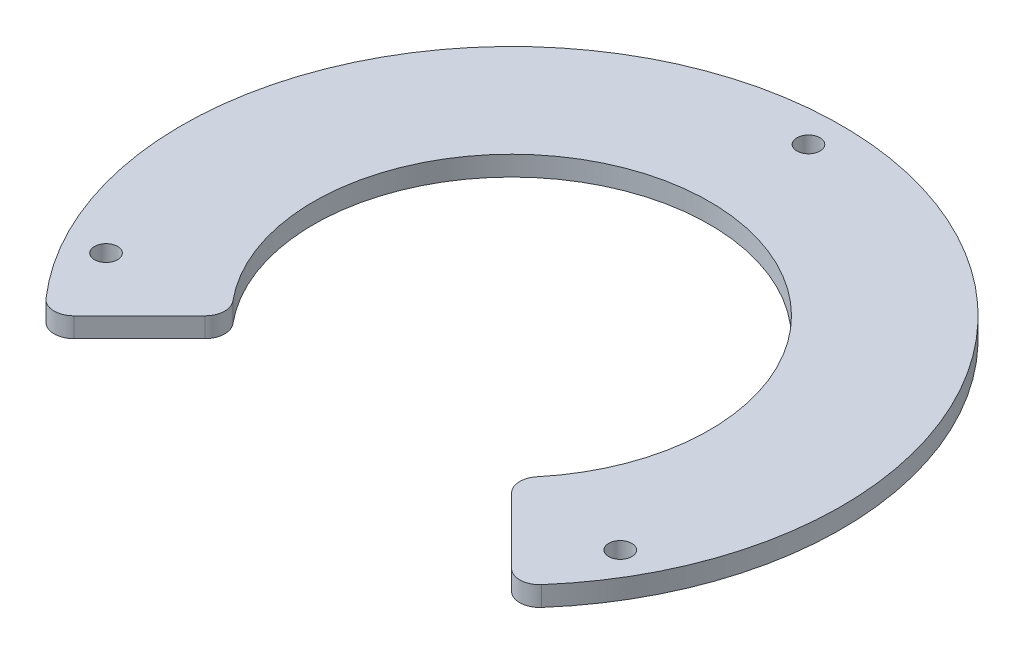
ISO-10303-21;
HEADER;
FILE_DESCRIPTION(('STEP AP214'),'2;1');
FILE_NAME('part.step','',(''),(''),'','','');
FILE_SCHEMA(('AUTOMOTIVE_DESIGN { 1 0 10303 214 1 1 1 1 }'));
ENDSEC;
DATA;
#1=APPLICATION_CONTEXT('core data for automotive mechanical design processes');
#2=APPLICATION_PROTOCOL_DEFINITION('international standard','automotive_design',2000,#1);
#3=PRODUCT_CONTEXT('',#1,'mechanical');
#4=PRODUCT('Part','Part','',(#3));
#5=PRODUCT_RELATED_PRODUCT_CATEGORY('part','',(#4));
#6=PRODUCT_DEFINITION_FORMATION('','',#4);
#7=PRODUCT_DEFINITION_CONTEXT('part definition',#1,'design');
#8=PRODUCT_DEFINITION('design','',#6,#7);
#9=PRODUCT_DEFINITION_SHAPE('','',#8);
#10=(LENGTH_UNIT() NAMED_UNIT(*) SI_UNIT(.MILLI.,.METRE.));
#11=(NAMED_UNIT(*) PLANE_ANGLE_UNIT() SI_UNIT($,.RADIAN.));
#12=(NAMED_UNIT(*) SI_UNIT($,.STERADIAN.) SOLID_ANGLE_UNIT());
#13=UNCERTAINTY_MEASURE_WITH_UNIT(LENGTH_MEASURE(1.E-05),#10,'distance_accuracy_value','');
#14=(GEOMETRIC_REPRESENTATION_CONTEXT(3) GLOBAL_UNCERTAINTY_ASSIGNED_CONTEXT((#13)) GLOBAL_UNIT_ASSIGNED_CONTEXT((#10,
#11,#12)) REPRESENTATION_CONTEXT('',''));
#15=CARTESIAN_POINT('',(0.,0.,0.));
#16=DIRECTION('',(0.,0.,1.));
#17=DIRECTION('',(1.,0.,0.));
#18=AXIS2_PLACEMENT_3D('',#15,#16,#17);
#19=CARTESIAN_POINT('',(0.,3.,0.));
#20=DIRECTION('',(0.,1.,0.));
#21=DIRECTION('',(0.,0.,1.));
#22=AXIS2_PLACEMENT_3D('',#19,#20,#21);
#23=PLANE('',#22);
#24=DIRECTION('',(-0.707106781186546,0.,0.707106781186549));
#25=VECTOR('',#24,1.);
#26=CARTESIAN_POINT('',(0.,3.,0.));
#27=LINE('',#26,#25);
#28=CARTESIAN_POINT('',(-23.2379000772445,3.,23.2379000772445));
#29=VERTEX_POINT('',#28);
#30=CARTESIAN_POINT('',(-33.166247903554,3.,33.1662479035541));
#31=VERTEX_POINT('',#30);
#32=EDGE_CURVE('E122',#29,#31,#27,.T.);
#33=ORIENTED_EDGE('',*,*,#32,.F.);
#34=CARTESIAN_POINT('',(-25.3592204208041,3.,21.1165797336849));
#35=DIRECTION('',(0.,1.,0.));
#36=DIRECTION('',(0.,0.,1.));
#37=AXIS2_PLACEMENT_3D('',#34,#35,#36);
#38=CIRCLE('',#37,3.);
#39=CARTESIAN_POINT('',(-23.0538367461855,3.,19.1968906669863));
#40=VERTEX_POINT('',#39);
#41=EDGE_CURVE('E125',#29,#40,#38,.T.);
#42=ORIENTED_EDGE('',*,*,#41,.T.);
#43=CARTESIAN_POINT('',(0.,3.,0.));
#44=DIRECTION('',(0.,1.,0.));
#45=DIRECTION('',(0.,0.,1.));
#46=AXIS2_PLACEMENT_3D('',#43,#44,#45);
#47=CIRCLE('',#46,30.);
#48=CARTESIAN_POINT('',(23.0538367461856,3.,19.1968906669863));
#49=VERTEX_POINT('',#48);
#50=EDGE_CURVE('E177',#49,#40,#47,.T.);
#51=ORIENTED_EDGE('',*,*,#50,.F.);
#52=CARTESIAN_POINT('',(25.3592204208041,3.,21.1165797336849));
#53=DIRECTION('',(0.,1.,0.));
#54=DIRECTION('',(0.,0.,1.));
#55=AXIS2_PLACEMENT_3D('',#52,#53,#54);
#56=CIRCLE('',#55,3.);
#57=CARTESIAN_POINT('',(23.2379000772445,3.,23.2379000772445));
#58=VERTEX_POINT('',#57);
#59=EDGE_CURVE('E126',#49,#58,#56,.T.);
#60=ORIENTED_EDGE('',*,*,#59,.T.);
#61=DIRECTION('',(-0.707106781186546,0.,-0.707106781186549));
#62=VECTOR('',#61,1.);
#63=CARTESIAN_POINT('',(49.9999999999998,3.,50.));
#64=LINE('',#63,#62);
#65=CARTESIAN_POINT('',(33.1662479035539,3.,33.1662479035541));
#66=VERTEX_POINT('',#65);
#67=EDGE_CURVE('E154',#66,#58,#64,.T.);
#68=ORIENTED_EDGE('',*,*,#67,.F.);
#69=CARTESIAN_POINT('',(35.2875682471136,3.,31.0449275599944));
#70=DIRECTION('',(0.,1.,0.));
#71=DIRECTION('',(0.,0.,1.));
#72=AXIS2_PLACEMENT_3D('',#69,#70,#71);
#73=CIRCLE('',#72,3.);
#74=CARTESIAN_POINT('',(37.5399662203336,3.,33.0265186808451));
#75=VERTEX_POINT('',#74);
#76=EDGE_CURVE('E128',#66,#75,#73,.T.);
#77=ORIENTED_EDGE('',*,*,#76,.T.);
#78=CARTESIAN_POINT('',(0.,3.,0.));
#79=DIRECTION('',(0.,1.,0.));
#80=DIRECTION('',(0.,0.,1.));
#81=AXIS2_PLACEMENT_3D('',#78,#79,#80);
#82=CIRCLE('',#81,50.);
#83=CARTESIAN_POINT('',(-37.5399662203336,3.,33.0265186808451));
#84=VERTEX_POINT('',#83);
#85=EDGE_CURVE('E130',#75,#84,#82,.T.);
#86=ORIENTED_EDGE('',*,*,#85,.T.);
#87=CARTESIAN_POINT('',(-35.2875682471136,3.,31.0449275599944));
#88=DIRECTION('',(0.,1.,0.));
#89=DIRECTION('',(0.,0.,1.));
#90=AXIS2_PLACEMENT_3D('',#87,#88,#89);
#91=CIRCLE('',#90,3.);
#92=EDGE_CURVE('E135',#84,#31,#91,.T.);
#93=ORIENTED_EDGE('',*,*,#92,.T.);
#94=EDGE_LOOP('',(#33,#42,#51,#60,#68,#77,#86,#93));
#95=FACE_BOUND('',#94,.T.);
#96=CARTESIAN_POINT('',(38.9711431703026,3.,22.4999999999983));
#97=DIRECTION('',(0.,1.,0.));
#98=DIRECTION('',(0.,0.,1.));
#99=AXIS2_PLACEMENT_3D('',#96,#97,#98);
#100=CIRCLE('',#99,1.75000000000246);
#101=CARTESIAN_POINT('',(38.9711431703026,3.,24.2500000000008));
#102=VERTEX_POINT('',#101);
#103=EDGE_CURVE('E166',#102,#102,#100,.T.);
#104=ORIENTED_EDGE('',*,*,#103,.F.);
#105=EDGE_LOOP('',(#104));
#106=FACE_BOUND('',#105,.T.);
#107=CARTESIAN_POINT('',(0.,3.,-45.));
#108=DIRECTION('',(0.,1.,0.));
#109=DIRECTION('',(0.,0.,1.));
#110=AXIS2_PLACEMENT_3D('',#107,#108,#109);
#111=CIRCLE('',#110,1.75);
#112=CARTESIAN_POINT('',(0.,3.,-43.25));
#113=VERTEX_POINT('',#112);
#114=EDGE_CURVE('E172',#113,#113,#111,.T.);
#115=ORIENTED_EDGE('',*,*,#114,.F.);
#116=EDGE_LOOP('',(#115));
#117=FACE_BOUND('',#116,.T.);
#118=CARTESIAN_POINT('',(-38.9711431702969,3.,22.5000000000017));
#119=DIRECTION('',(0.,1.,0.));
#120=DIRECTION('',(0.,0.,1.));
#121=AXIS2_PLACEMENT_3D('',#118,#119,#120);
#122=CIRCLE('',#121,1.75000000000364);
#123=CARTESIAN_POINT('',(-38.9711431702969,3.,24.2500000000053));
#124=VERTEX_POINT('',#123);
#125=EDGE_CURVE('E159',#124,#124,#122,.T.);
#126=ORIENTED_EDGE('',*,*,#125,.F.);
#127=EDGE_LOOP('',(#126));
#128=FACE_BOUND('',#127,.T.);
#129=ADVANCED_FACE('F33',(#95,#106,#117,#128),#23,.T.);
#130=CARTESIAN_POINT('',(0.,0.,0.));
#131=DIRECTION('',(0.,1.,0.));
#132=DIRECTION('',(0.,0.,1.));
#133=AXIS2_PLACEMENT_3D('',#130,#131,#132);
#134=PLANE('',#133);
#135=CARTESIAN_POINT('',(0.,0.,0.));
#136=DIRECTION('',(0.,1.,0.));
#137=DIRECTION('',(0.,0.,1.));
#138=AXIS2_PLACEMENT_3D('',#135,#136,#137);
#139=CIRCLE('',#138,30.);
#140=CARTESIAN_POINT('',(23.0538367461856,0.,19.1968906669863));
#141=VERTEX_POINT('',#140);
#142=CARTESIAN_POINT('',(-23.0538367461855,0.,19.1968906669863));
#143=VERTEX_POINT('',#142);
#144=EDGE_CURVE('E106',#141,#143,#139,.T.);
#145=ORIENTED_EDGE('',*,*,#144,.T.);
#146=CARTESIAN_POINT('',(-25.3592204208041,0.,21.1165797336849));
#147=DIRECTION('',(0.,1.,0.));
#148=DIRECTION('',(0.,0.,1.));
#149=AXIS2_PLACEMENT_3D('',#146,#147,#148);
#150=CIRCLE('',#149,3.);
#151=CARTESIAN_POINT('',(-23.2379000772445,0.,23.2379000772445));
#152=VERTEX_POINT('',#151);
#153=EDGE_CURVE('E99',#143,#152,#150,.F.);
#154=ORIENTED_EDGE('',*,*,#153,.T.);
#155=DIRECTION('',(-0.707106781186546,0.,0.707106781186549));
#156=VECTOR('',#155,1.);
#157=CARTESIAN_POINT('',(0.,0.,0.));
#158=LINE('',#157,#156);
#159=CARTESIAN_POINT('',(-33.166247903554,0.,33.1662479035541));
#160=VERTEX_POINT('',#159);
#161=EDGE_CURVE('E103',#152,#160,#158,.T.);
#162=ORIENTED_EDGE('',*,*,#161,.T.);
#163=CARTESIAN_POINT('',(-35.2875682471136,0.,31.0449275599944));
#164=DIRECTION('',(0.,1.,0.));
#165=DIRECTION('',(0.,0.,1.));
#166=AXIS2_PLACEMENT_3D('',#163,#164,#165);
#167=CIRCLE('',#166,3.);
#168=CARTESIAN_POINT('',(-37.5399662203336,0.,33.0265186808451));
#169=VERTEX_POINT('',#168);
#170=EDGE_CURVE('E111',#160,#169,#167,.F.);
#171=ORIENTED_EDGE('',*,*,#170,.T.);
#172=CARTESIAN_POINT('',(0.,0.,0.));
#173=DIRECTION('',(0.,1.,0.));
#174=DIRECTION('',(0.,0.,1.));
#175=AXIS2_PLACEMENT_3D('',#172,#173,#174);
#176=CIRCLE('',#175,50.);
#177=CARTESIAN_POINT('',(37.5399662203336,0.,33.0265186808451));
#178=VERTEX_POINT('',#177);
#179=EDGE_CURVE('E180',#178,#169,#176,.T.);
#180=ORIENTED_EDGE('',*,*,#179,.F.);
#181=CARTESIAN_POINT('',(35.2875682471136,0.,31.0449275599944));
#182=DIRECTION('',(0.,1.,0.));
#183=DIRECTION('',(0.,0.,1.));
#184=AXIS2_PLACEMENT_3D('',#181,#182,#183);
#185=CIRCLE('',#184,3.);
#186=CARTESIAN_POINT('',(33.166247903554,0.,33.1662479035541));
#187=VERTEX_POINT('',#186);
#188=EDGE_CURVE('E56',#178,#187,#185,.F.);
#189=ORIENTED_EDGE('',*,*,#188,.T.);
#190=DIRECTION('',(-0.707106781186546,0.,-0.707106781186549));
#191=VECTOR('',#190,1.);
#192=CARTESIAN_POINT('',(0.,0.,0.));
#193=LINE('',#192,#191);
#194=CARTESIAN_POINT('',(23.2379000772445,0.,23.2379000772445));
#195=VERTEX_POINT('',#194);
#196=EDGE_CURVE('E121',#187,#195,#193,.T.);
#197=ORIENTED_EDGE('',*,*,#196,.T.);
#198=CARTESIAN_POINT('',(25.3592204208041,0.,21.1165797336849));
#199=DIRECTION('',(0.,1.,0.));
#200=DIRECTION('',(0.,0.,1.));
#201=AXIS2_PLACEMENT_3D('',#198,#199,#200);
#202=CIRCLE('',#201,3.);
#203=EDGE_CURVE('E48',#195,#141,#202,.F.);
#204=ORIENTED_EDGE('',*,*,#203,.T.);
#205=EDGE_LOOP('',(#145,#154,#162,#171,#180,#189,#197,#204));
#206=FACE_BOUND('',#205,.T.);
#207=CARTESIAN_POINT('',(0.,0.,-45.));
#208=DIRECTION('',(0.,1.,0.));
#209=DIRECTION('',(0.,0.,1.));
#210=AXIS2_PLACEMENT_3D('',#207,#208,#209);
#211=CIRCLE('',#210,1.75);
#212=CARTESIAN_POINT('',(0.,0.,-43.25));
#213=VERTEX_POINT('',#212);
#214=EDGE_CURVE('E169',#213,#213,#211,.T.);
#215=ORIENTED_EDGE('',*,*,#214,.T.);
#216=EDGE_LOOP('',(#215));
#217=FACE_BOUND('',#216,.T.);
#218=CARTESIAN_POINT('',(38.9711431703026,0.,22.4999999999983));
#219=DIRECTION('',(0.,1.,0.));
#220=DIRECTION('',(0.,0.,1.));
#221=AXIS2_PLACEMENT_3D('',#218,#219,#220);
#222=CIRCLE('',#221,1.75000000000246);
#223=CARTESIAN_POINT('',(38.9711431703026,0.,24.2500000000008));
#224=VERTEX_POINT('',#223);
#225=EDGE_CURVE('E164',#224,#224,#222,.T.);
#226=ORIENTED_EDGE('',*,*,#225,.T.);
#227=EDGE_LOOP('',(#226));
#228=FACE_BOUND('',#227,.T.);
#229=CARTESIAN_POINT('',(-38.9711431702969,0.,22.5000000000017));
#230=DIRECTION('',(0.,1.,0.));
#231=DIRECTION('',(0.,0.,1.));
#232=AXIS2_PLACEMENT_3D('',#229,#230,#231);
#233=CIRCLE('',#232,1.75000000000364);
#234=CARTESIAN_POINT('',(-38.9711431702969,0.,24.2500000000053));
#235=VERTEX_POINT('',#234);
#236=EDGE_CURVE('E156',#235,#235,#233,.T.);
#237=ORIENTED_EDGE('',*,*,#236,.T.);
#238=EDGE_LOOP('',(#237));
#239=FACE_BOUND('',#238,.T.);
#240=ADVANCED_FACE('F101',(#206,#217,#228,#239),#134,.F.);
#241=CARTESIAN_POINT('',(0.,3.,0.));
#242=DIRECTION('',(0.,-1.,0.));
#243=DIRECTION('',(0.,0.,-1.));
#244=AXIS2_PLACEMENT_3D('',#241,#242,#243);
#245=CYLINDRICAL_SURFACE('',#244,50.);
#246=ORIENTED_EDGE('',*,*,#179,.T.);
#247=DIRECTION('',(0.,-1.,0.));
#248=VECTOR('',#247,1.);
#249=CARTESIAN_POINT('',(-37.5399662203336,3.,33.0265186808451));
#250=LINE('',#249,#248);
#251=EDGE_CURVE('E147',#169,#84,#250,.F.);
#252=ORIENTED_EDGE('',*,*,#251,.T.);
#253=ORIENTED_EDGE('',*,*,#85,.F.);
#254=DIRECTION('',(0.,-1.,0.));
#255=VECTOR('',#254,1.);
#256=CARTESIAN_POINT('',(37.5399662203336,3.,33.0265186808451));
#257=LINE('',#256,#255);
#258=EDGE_CURVE('E110',#75,#178,#257,.T.);
#259=ORIENTED_EDGE('',*,*,#258,.T.);
#260=EDGE_LOOP('',(#246,#252,#253,#259));
#261=FACE_BOUND('',#260,.T.);
#262=ADVANCED_FACE('F186',(#261),#245,.T.);
#263=CARTESIAN_POINT('',(0.,3.,0.));
#264=DIRECTION('',(0.,-1.,0.));
#265=DIRECTION('',(0.,0.,-1.));
#266=AXIS2_PLACEMENT_3D('',#263,#264,#265);
#267=CYLINDRICAL_SURFACE('',#266,30.);
#268=ORIENTED_EDGE('',*,*,#50,.T.);
#269=DIRECTION('',(0.,-1.,0.));
#270=VECTOR('',#269,1.);
#271=CARTESIAN_POINT('',(-23.0538367461856,3.,19.1968906669863));
#272=LINE('',#271,#270);
#273=EDGE_CURVE('E140',#40,#143,#272,.T.);
#274=ORIENTED_EDGE('',*,*,#273,.T.);
#275=ORIENTED_EDGE('',*,*,#144,.F.);
#276=DIRECTION('',(0.,-1.,0.));
#277=VECTOR('',#276,1.);
#278=CARTESIAN_POINT('',(23.0538367461856,3.,19.1968906669863));
#279=LINE('',#278,#277);
#280=EDGE_CURVE('E138',#141,#49,#279,.F.);
#281=ORIENTED_EDGE('',*,*,#280,.T.);
#282=EDGE_LOOP('',(#268,#274,#275,#281));
#283=FACE_BOUND('',#282,.T.);
#284=ADVANCED_FACE('F199',(#283),#267,.F.);
#285=CARTESIAN_POINT('',(0.,3.,-45.));
#286=DIRECTION('',(0.,-1.,0.));
#287=DIRECTION('',(0.,0.,-1.));
#288=AXIS2_PLACEMENT_3D('',#285,#286,#287);
#289=CYLINDRICAL_SURFACE('',#288,1.75);
#290=ORIENTED_EDGE('',*,*,#114,.T.);
#291=EDGE_LOOP('',(#290));
#292=FACE_BOUND('',#291,.T.);
#293=ORIENTED_EDGE('',*,*,#214,.F.);
#294=EDGE_LOOP('',(#293));
#295=FACE_BOUND('',#294,.T.);
#296=ADVANCED_FACE('F201',(#292,#295),#289,.F.);
#297=CARTESIAN_POINT('',(38.9711431703026,3.,22.4999999999983));
#298=DIRECTION('',(0.,-1.,0.));
#299=DIRECTION('',(0.,0.,-1.));
#300=AXIS2_PLACEMENT_3D('',#297,#298,#299);
#301=CYLINDRICAL_SURFACE('',#300,1.75000000000246);
#302=ORIENTED_EDGE('',*,*,#103,.T.);
#303=EDGE_LOOP('',(#302));
#304=FACE_BOUND('',#303,.T.);
#305=ORIENTED_EDGE('',*,*,#225,.F.);
#306=EDGE_LOOP('',(#305));
#307=FACE_BOUND('',#306,.T.);
#308=ADVANCED_FACE('F207',(#304,#307),#301,.F.);
#309=CARTESIAN_POINT('',(-38.9711431702969,3.,22.5000000000017));
#310=DIRECTION('',(0.,-1.,0.));
#311=DIRECTION('',(0.,0.,-1.));
#312=AXIS2_PLACEMENT_3D('',#309,#310,#311);
#313=CYLINDRICAL_SURFACE('',#312,1.75000000000364);
#314=ORIENTED_EDGE('',*,*,#125,.T.);
#315=EDGE_LOOP('',(#314));
#316=FACE_BOUND('',#315,.T.);
#317=ORIENTED_EDGE('',*,*,#236,.F.);
#318=EDGE_LOOP('',(#317));
#319=FACE_BOUND('',#318,.T.);
#320=ADVANCED_FACE('F259',(#316,#319),#313,.F.);
#321=CARTESIAN_POINT('',(0.,-11.,0.));
#322=DIRECTION('',(-0.707106781186549,0.,-0.707106781186546));
#323=DIRECTION('',(-0.707106781186546,0.,0.707106781186549));
#324=AXIS2_PLACEMENT_3D('',#321,#322,#323);
#325=PLANE('',#324);
#326=ORIENTED_EDGE('',*,*,#161,.F.);
#327=DIRECTION('',(0.,1.,0.));
#328=VECTOR('',#327,1.);
#329=CARTESIAN_POINT('',(-23.2379000772445,3.,23.2379000772445));
#330=LINE('',#329,#328);
#331=EDGE_CURVE('E117',#152,#29,#330,.T.);
#332=ORIENTED_EDGE('',*,*,#331,.T.);
#333=ORIENTED_EDGE('',*,*,#32,.T.);
#334=DIRECTION('',(0.,-1.,0.));
#335=VECTOR('',#334,1.);
#336=CARTESIAN_POINT('',(-33.166247903554,-11.,33.1662479035541));
#337=LINE('',#336,#335);
#338=EDGE_CURVE('E120',#31,#160,#337,.T.);
#339=ORIENTED_EDGE('',*,*,#338,.T.);
#340=EDGE_LOOP('',(#326,#332,#333,#339));
#341=FACE_BOUND('',#340,.T.);
#342=ADVANCED_FACE('F115',(#341),#325,.F.);
#343=CARTESIAN_POINT('',(49.9999999999998,-11.,50.));
#344=DIRECTION('',(0.707106781186549,0.,-0.707106781186546));
#345=DIRECTION('',(-0.707106781186546,0.,-0.707106781186549));
#346=AXIS2_PLACEMENT_3D('',#343,#344,#345);
#347=PLANE('',#346);
#348=ORIENTED_EDGE('',*,*,#196,.F.);
#349=DIRECTION('',(0.,-1.,0.));
#350=VECTOR('',#349,1.);
#351=CARTESIAN_POINT('',(33.1662479035539,-11.,33.1662479035541));
#352=LINE('',#351,#350);
#353=EDGE_CURVE('E11',#187,#66,#352,.F.);
#354=ORIENTED_EDGE('',*,*,#353,.T.);
#355=ORIENTED_EDGE('',*,*,#67,.T.);
#356=DIRECTION('',(0.,1.,0.));
#357=VECTOR('',#356,1.);
#358=CARTESIAN_POINT('',(23.2379000772445,0.,23.2379000772445));
#359=LINE('',#358,#357);
#360=EDGE_CURVE('E41',#58,#195,#359,.F.);
#361=ORIENTED_EDGE('',*,*,#360,.T.);
#362=EDGE_LOOP('',(#348,#354,#355,#361));
#363=FACE_BOUND('',#362,.T.);
#364=ADVANCED_FACE('F151',(#363),#347,.F.);
#365=CARTESIAN_POINT('',(-25.3592204208041,3.,21.1165797336849));
#366=DIRECTION('',(0.,-1.,0.));
#367=DIRECTION('',(0.,0.,-1.));
#368=AXIS2_PLACEMENT_3D('',#365,#366,#367);
#369=CYLINDRICAL_SURFACE('',#368,3.);
#370=ORIENTED_EDGE('',*,*,#153,.F.);
#371=ORIENTED_EDGE('',*,*,#273,.F.);
#372=ORIENTED_EDGE('',*,*,#41,.F.);
#373=ORIENTED_EDGE('',*,*,#331,.F.);
#374=EDGE_LOOP('',(#370,#371,#372,#373));
#375=FACE_BOUND('',#374,.T.);
#376=ADVANCED_FACE('F124',(#375),#369,.T.);
#377=CARTESIAN_POINT('',(-35.2875682471136,3.,31.0449275599944));
#378=DIRECTION('',(0.,-1.,0.));
#379=DIRECTION('',(0.,0.,-1.));
#380=AXIS2_PLACEMENT_3D('',#377,#378,#379);
#381=CYLINDRICAL_SURFACE('',#380,3.);
#382=ORIENTED_EDGE('',*,*,#170,.F.);
#383=ORIENTED_EDGE('',*,*,#338,.F.);
#384=ORIENTED_EDGE('',*,*,#92,.F.);
#385=ORIENTED_EDGE('',*,*,#251,.F.);
#386=EDGE_LOOP('',(#382,#383,#384,#385));
#387=FACE_BOUND('',#386,.T.);
#388=ADVANCED_FACE('F190',(#387),#381,.T.);
#389=CARTESIAN_POINT('',(35.2875682471136,3.,31.0449275599944));
#390=DIRECTION('',(0.,-1.,0.));
#391=DIRECTION('',(0.,0.,-1.));
#392=AXIS2_PLACEMENT_3D('',#389,#390,#391);
#393=CYLINDRICAL_SURFACE('',#392,3.);
#394=ORIENTED_EDGE('',*,*,#76,.F.);
#395=ORIENTED_EDGE('',*,*,#353,.F.);
#396=ORIENTED_EDGE('',*,*,#188,.F.);
#397=ORIENTED_EDGE('',*,*,#258,.F.);
#398=EDGE_LOOP('',(#394,#395,#396,#397));
#399=FACE_BOUND('',#398,.T.);
#400=ADVANCED_FACE('F196',(#399),#393,.T.);
#401=CARTESIAN_POINT('',(25.3592204208041,3.,21.1165797336849));
#402=DIRECTION('',(0.,-1.,0.));
#403=DIRECTION('',(0.,0.,-1.));
#404=AXIS2_PLACEMENT_3D('',#401,#402,#403);
#405=CYLINDRICAL_SURFACE('',#404,3.);
#406=ORIENTED_EDGE('',*,*,#59,.F.);
#407=ORIENTED_EDGE('',*,*,#280,.F.);
#408=ORIENTED_EDGE('',*,*,#203,.F.);
#409=ORIENTED_EDGE('',*,*,#360,.F.);
#410=EDGE_LOOP('',(#406,#407,#408,#409));
#411=FACE_BOUND('',#410,.T.);
#412=ADVANCED_FACE('F35',(#411),#405,.T.);
#413=CLOSED_SHELL('',(#129,#240,#262,#284,#296,#308,#320,#342,#364,#376,#388,#400,#412));
#414=MANIFOLD_SOLID_BREP('B2',#413);
#415=ADVANCED_BREP_SHAPE_REPRESENTATION('',(#18,#414),#14);
#416=SHAPE_DEFINITION_REPRESENTATION(#9,#415);
ENDSEC;
END-ISO-10303-21;
